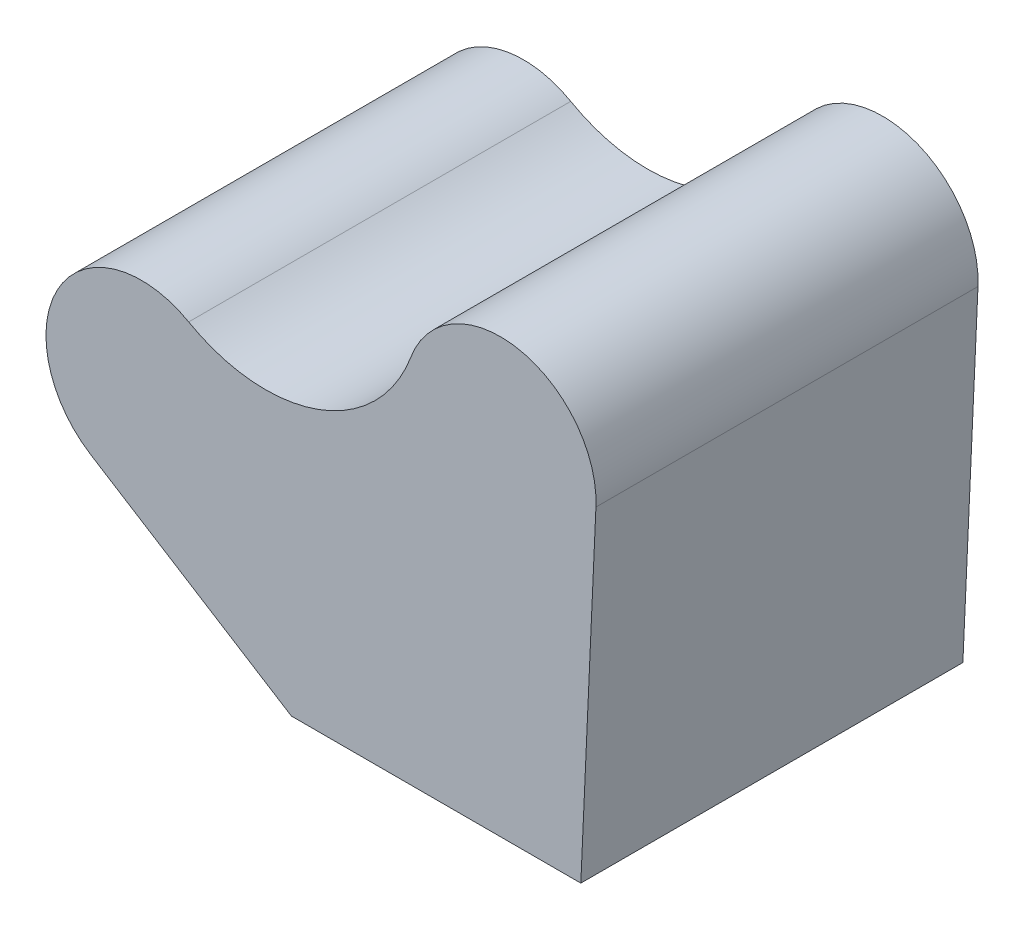
ISO-10303-21;
HEADER;
FILE_DESCRIPTION(('STEP AP214'),'2;1');
FILE_NAME('part.step','',(''),(''),'','','');
FILE_SCHEMA(('AUTOMOTIVE_DESIGN { 1 0 10303 214 1 1 1 1 }'));
ENDSEC;
DATA;
#1=APPLICATION_CONTEXT('core data for automotive mechanical design processes');
#2=APPLICATION_PROTOCOL_DEFINITION('international standard','automotive_design',2000,#1);
#3=PRODUCT_CONTEXT('',#1,'mechanical');
#4=PRODUCT('Part','Part','',(#3));
#5=PRODUCT_RELATED_PRODUCT_CATEGORY('part','',(#4));
#6=PRODUCT_DEFINITION_FORMATION('','',#4);
#7=PRODUCT_DEFINITION_CONTEXT('part definition',#1,'design');
#8=PRODUCT_DEFINITION('design','',#6,#7);
#9=PRODUCT_DEFINITION_SHAPE('','',#8);
#10=(LENGTH_UNIT() NAMED_UNIT(*) SI_UNIT(.MILLI.,.METRE.));
#11=(NAMED_UNIT(*) PLANE_ANGLE_UNIT() SI_UNIT($,.RADIAN.));
#12=(NAMED_UNIT(*) SI_UNIT($,.STERADIAN.) SOLID_ANGLE_UNIT());
#13=UNCERTAINTY_MEASURE_WITH_UNIT(LENGTH_MEASURE(1.E-05),#10,'distance_accuracy_value','');
#14=(GEOMETRIC_REPRESENTATION_CONTEXT(3) GLOBAL_UNCERTAINTY_ASSIGNED_CONTEXT((#13)) GLOBAL_UNIT_ASSIGNED_CONTEXT((#10,
#11,#12)) REPRESENTATION_CONTEXT('',''));
#15=CARTESIAN_POINT('',(0.,0.,0.));
#16=DIRECTION('',(0.,0.,1.));
#17=DIRECTION('',(1.,0.,0.));
#18=AXIS2_PLACEMENT_3D('',#15,#16,#17);
#19=CARTESIAN_POINT('',(0.,0.,20.));
#20=DIRECTION('',(0.,0.,-1.));
#21=DIRECTION('',(-1.,0.,0.));
#22=AXIS2_PLACEMENT_3D('',#19,#20,#21);
#23=CYLINDRICAL_SURFACE('',#22,10.);
#24=CARTESIAN_POINT('',(0.,0.,-20.));
#25=DIRECTION('',(0.,0.,-1.));
#26=DIRECTION('',(-1.,0.,0.));
#27=AXIS2_PLACEMENT_3D('',#24,#25,#26);
#28=CIRCLE('',#27,10.);
#29=CARTESIAN_POINT('',(-5.31863120767935,-8.46830337651523,-20.));
#30=VERTEX_POINT('',#29);
#31=CARTESIAN_POINT('',(4.94046004116646,8.69435762903951,-20.));
#32=VERTEX_POINT('',#31);
#33=EDGE_CURVE('E122',#30,#32,#28,.T.);
#34=ORIENTED_EDGE('',*,*,#33,.F.);
#35=DIRECTION('',(0.,0.,-1.));
#36=VECTOR('',#35,1.);
#37=CARTESIAN_POINT('',(-5.31863120767935,-8.46830337651523,20.));
#38=LINE('',#37,#36);
#39=CARTESIAN_POINT('',(-5.31863120767935,-8.46830337651523,20.));
#40=VERTEX_POINT('',#39);
#41=EDGE_CURVE('E11',#40,#30,#38,.T.);
#42=ORIENTED_EDGE('',*,*,#41,.F.);
#43=CARTESIAN_POINT('',(0.,0.,20.));
#44=DIRECTION('',(0.,0.,-1.));
#45=DIRECTION('',(-1.,0.,0.));
#46=AXIS2_PLACEMENT_3D('',#43,#44,#45);
#47=CIRCLE('',#46,10.);
#48=CARTESIAN_POINT('',(4.94046004116646,8.69435762903951,20.));
#49=VERTEX_POINT('',#48);
#50=EDGE_CURVE('E134',#40,#49,#47,.T.);
#51=ORIENTED_EDGE('',*,*,#50,.T.);
#52=DIRECTION('',(0.,0.,-1.));
#53=VECTOR('',#52,1.);
#54=CARTESIAN_POINT('',(4.94046004116646,8.69435762903951,20.));
#55=LINE('',#54,#53);
#56=EDGE_CURVE('E38',#49,#32,#55,.T.);
#57=ORIENTED_EDGE('',*,*,#56,.T.);
#58=EDGE_LOOP('',(#34,#42,#51,#57));
#59=FACE_BOUND('',#58,.T.);
#60=ADVANCED_FACE('F35',(#59),#23,.T.);
#61=CARTESIAN_POINT('',(-5.31863120767935,-8.46830337651523,20.));
#62=DIRECTION('',(0.531863120767936,0.846830337651523,0.));
#63=DIRECTION('',(-0.846830337651523,0.531863120767936,0.));
#64=AXIS2_PLACEMENT_3D('',#61,#62,#63);
#65=PLANE('',#64);
#66=DIRECTION('',(0.846830337651523,-0.531863120767936,0.));
#67=VECTOR('',#66,1.);
#68=CARTESIAN_POINT('',(-5.31863120767935,-8.46830337651523,-20.));
#69=LINE('',#68,#67);
#70=CARTESIAN_POINT('',(15.689460365573,-21.6627162934111,-20.));
#71=VERTEX_POINT('',#70);
#72=EDGE_CURVE('E74',#30,#71,#69,.T.);
#73=ORIENTED_EDGE('',*,*,#72,.T.);
#74=DIRECTION('',(0.,0.,-1.));
#75=VECTOR('',#74,1.);
#76=CARTESIAN_POINT('',(15.689460365573,-21.6627162934111,20.));
#77=LINE('',#76,#75);
#78=CARTESIAN_POINT('',(15.689460365573,-21.6627162934111,20.));
#79=VERTEX_POINT('',#78);
#80=EDGE_CURVE('E44',#79,#71,#77,.T.);
#81=ORIENTED_EDGE('',*,*,#80,.F.);
#82=DIRECTION('',(0.846830337651523,-0.531863120767936,0.));
#83=VECTOR('',#82,1.);
#84=CARTESIAN_POINT('',(-5.31863120767935,-8.46830337651523,20.));
#85=LINE('',#84,#83);
#86=EDGE_CURVE('E101',#40,#79,#85,.T.);
#87=ORIENTED_EDGE('',*,*,#86,.F.);
#88=ORIENTED_EDGE('',*,*,#41,.T.);
#89=EDGE_LOOP('',(#73,#81,#87,#88));
#90=FACE_BOUND('',#89,.T.);
#91=ADVANCED_FACE('F153',(#90),#65,.F.);
#92=CARTESIAN_POINT('',(15.689460365573,-21.6627162934111,20.));
#93=DIRECTION('',(0.,1.,0.));
#94=DIRECTION('',(-1.,0.,0.));
#95=AXIS2_PLACEMENT_3D('',#92,#93,#94);
#96=PLANE('',#95);
#97=DIRECTION('',(1.,0.,0.));
#98=VECTOR('',#97,1.);
#99=CARTESIAN_POINT('',(15.689460365573,-21.6627162934111,-20.));
#100=LINE('',#99,#98);
#101=CARTESIAN_POINT('',(45.9952917199994,-21.6627162934111,-20.));
#102=VERTEX_POINT('',#101);
#103=EDGE_CURVE('E108',#71,#102,#100,.T.);
#104=ORIENTED_EDGE('',*,*,#103,.T.);
#105=DIRECTION('',(0.,0.,-1.));
#106=VECTOR('',#105,1.);
#107=CARTESIAN_POINT('',(45.9952917199994,-21.6627162934111,20.));
#108=LINE('',#107,#106);
#109=CARTESIAN_POINT('',(45.9952917199994,-21.6627162934111,20.));
#110=VERTEX_POINT('',#109);
#111=EDGE_CURVE('E105',#110,#102,#108,.T.);
#112=ORIENTED_EDGE('',*,*,#111,.F.);
#113=DIRECTION('',(1.,0.,0.));
#114=VECTOR('',#113,1.);
#115=CARTESIAN_POINT('',(15.689460365573,-21.6627162934111,20.));
#116=LINE('',#115,#114);
#117=EDGE_CURVE('E93',#79,#110,#116,.T.);
#118=ORIENTED_EDGE('',*,*,#117,.F.);
#119=ORIENTED_EDGE('',*,*,#80,.T.);
#120=EDGE_LOOP('',(#104,#112,#118,#119));
#121=FACE_BOUND('',#120,.T.);
#122=ADVANCED_FACE('F106',(#121),#96,.F.);
#123=CARTESIAN_POINT('',(47.5774393384329,13.2278107223206,20.));
#124=DIRECTION('',(0.998973450699644,-0.0452995010705945,0.));
#125=DIRECTION('',(0.0452995010705945,0.998973450699645,0.));
#126=AXIS2_PLACEMENT_3D('',#123,#124,#125);
#127=PLANE('',#126);
#128=DIRECTION('',(-0.0452995010705945,-0.998973450699644,0.));
#129=VECTOR('',#128,1.);
#130=CARTESIAN_POINT('',(47.5774393384329,13.2278107223206,-20.));
#131=LINE('',#130,#129);
#132=CARTESIAN_POINT('',(47.5774393384329,13.2278107223206,-20.));
#133=VERTEX_POINT('',#132);
#134=EDGE_CURVE('E131',#133,#102,#131,.T.);
#135=ORIENTED_EDGE('',*,*,#134,.F.);
#136=DIRECTION('',(0.,0.,-1.));
#137=VECTOR('',#136,1.);
#138=CARTESIAN_POINT('',(47.5774393384329,13.2278107223206,20.));
#139=LINE('',#138,#137);
#140=CARTESIAN_POINT('',(47.5774393384329,13.2278107223206,20.));
#141=VERTEX_POINT('',#140);
#142=EDGE_CURVE('E112',#141,#133,#139,.T.);
#143=ORIENTED_EDGE('',*,*,#142,.F.);
#144=DIRECTION('',(-0.0452995010705945,-0.998973450699644,0.));
#145=VECTOR('',#144,1.);
#146=CARTESIAN_POINT('',(47.5774393384329,13.2278107223206,20.));
#147=LINE('',#146,#145);
#148=EDGE_CURVE('E99',#141,#110,#147,.T.);
#149=ORIENTED_EDGE('',*,*,#148,.T.);
#150=ORIENTED_EDGE('',*,*,#111,.T.);
#151=EDGE_LOOP('',(#135,#143,#149,#150));
#152=FACE_BOUND('',#151,.T.);
#153=ADVANCED_FACE('F114',(#152),#127,.T.);
#154=CARTESIAN_POINT('',(37.5877048314364,13.6808057330265,20.));
#155=DIRECTION('',(0.,0.,-1.));
#156=DIRECTION('',(-1.,0.,0.));
#157=AXIS2_PLACEMENT_3D('',#154,#155,#156);
#158=CYLINDRICAL_SURFACE('',#157,10.);
#159=CARTESIAN_POINT('',(37.5877048314364,13.6808057330265,-20.));
#160=DIRECTION('',(0.,0.,-1.));
#161=DIRECTION('',(-1.,0.,0.));
#162=AXIS2_PLACEMENT_3D('',#159,#160,#161);
#163=CIRCLE('',#162,10.);
#164=CARTESIAN_POINT('',(28.2144675123193,17.1654035806282,-20.));
#165=VERTEX_POINT('',#164);
#166=EDGE_CURVE('E128',#165,#133,#163,.T.);
#167=ORIENTED_EDGE('',*,*,#166,.F.);
#168=DIRECTION('',(0.,0.,-1.));
#169=VECTOR('',#168,1.);
#170=CARTESIAN_POINT('',(28.2144675123193,17.1654035806282,20.));
#171=LINE('',#170,#169);
#172=CARTESIAN_POINT('',(28.2144675123193,17.1654035806282,20.));
#173=VERTEX_POINT('',#172);
#174=EDGE_CURVE('E137',#173,#165,#171,.T.);
#175=ORIENTED_EDGE('',*,*,#174,.F.);
#176=CARTESIAN_POINT('',(37.5877048314364,13.6808057330265,20.));
#177=DIRECTION('',(0.,0.,-1.));
#178=DIRECTION('',(-1.,0.,0.));
#179=AXIS2_PLACEMENT_3D('',#176,#177,#178);
#180=CIRCLE('',#179,10.);
#181=EDGE_CURVE('E115',#173,#141,#180,.T.);
#182=ORIENTED_EDGE('',*,*,#181,.T.);
#183=ORIENTED_EDGE('',*,*,#142,.T.);
#184=EDGE_LOOP('',(#167,#175,#182,#183));
#185=FACE_BOUND('',#184,.T.);
#186=ADVANCED_FACE('F143',(#185),#158,.T.);
#187=CARTESIAN_POINT('',(12.9736258273936,22.8313439940448,20.));
#188=DIRECTION('',(0.,0.,-1.));
#189=DIRECTION('',(-1.,0.,0.));
#190=AXIS2_PLACEMENT_3D('',#187,#188,#189);
#191=CYLINDRICAL_SURFACE('',#190,16.2599549825132);
#192=CARTESIAN_POINT('',(12.9736258273936,22.8313439940448,-20.));
#193=DIRECTION('',(0.,0.,1.));
#194=DIRECTION('',(1.,0.,0.));
#195=AXIS2_PLACEMENT_3D('',#192,#193,#194);
#196=CIRCLE('',#195,16.2599549825132);
#197=EDGE_CURVE('E125',#32,#165,#196,.T.);
#198=ORIENTED_EDGE('',*,*,#197,.F.);
#199=ORIENTED_EDGE('',*,*,#56,.F.);
#200=CARTESIAN_POINT('',(12.9736258273936,22.8313439940448,20.));
#201=DIRECTION('',(0.,0.,1.));
#202=DIRECTION('',(1.,0.,0.));
#203=AXIS2_PLACEMENT_3D('',#200,#201,#202);
#204=CIRCLE('',#203,16.2599549825132);
#205=EDGE_CURVE('E117',#49,#173,#204,.T.);
#206=ORIENTED_EDGE('',*,*,#205,.T.);
#207=ORIENTED_EDGE('',*,*,#174,.T.);
#208=EDGE_LOOP('',(#198,#199,#206,#207));
#209=FACE_BOUND('',#208,.T.);
#210=ADVANCED_FACE('F139',(#209),#191,.F.);
#211=CARTESIAN_POINT('',(0.,0.,20.));
#212=DIRECTION('',(0.,0.,-1.));
#213=DIRECTION('',(-1.,0.,0.));
#214=AXIS2_PLACEMENT_3D('',#211,#212,#213);
#215=PLANE('',#214);
#216=ORIENTED_EDGE('',*,*,#50,.F.);
#217=ORIENTED_EDGE('',*,*,#86,.T.);
#218=ORIENTED_EDGE('',*,*,#117,.T.);
#219=ORIENTED_EDGE('',*,*,#148,.F.);
#220=ORIENTED_EDGE('',*,*,#181,.F.);
#221=ORIENTED_EDGE('',*,*,#205,.F.);
#222=EDGE_LOOP('',(#216,#217,#218,#219,#220,#221));
#223=FACE_BOUND('',#222,.T.);
#224=ADVANCED_FACE('F96',(#223),#215,.F.);
#225=CARTESIAN_POINT('',(0.,0.,-20.));
#226=DIRECTION('',(0.,0.,-1.));
#227=DIRECTION('',(-1.,0.,0.));
#228=AXIS2_PLACEMENT_3D('',#225,#226,#227);
#229=PLANE('',#228);
#230=ORIENTED_EDGE('',*,*,#33,.T.);
#231=ORIENTED_EDGE('',*,*,#197,.T.);
#232=ORIENTED_EDGE('',*,*,#166,.T.);
#233=ORIENTED_EDGE('',*,*,#134,.T.);
#234=ORIENTED_EDGE('',*,*,#103,.F.);
#235=ORIENTED_EDGE('',*,*,#72,.F.);
#236=EDGE_LOOP('',(#230,#231,#232,#233,#234,#235));
#237=FACE_BOUND('',#236,.T.);
#238=ADVANCED_FACE('F141',(#237),#229,.T.);
#239=CLOSED_SHELL('',(#60,#91,#122,#153,#186,#210,#224,#238));
#240=MANIFOLD_SOLID_BREP('B2',#239);
#241=ADVANCED_BREP_SHAPE_REPRESENTATION('',(#18,#240),#14);
#242=SHAPE_DEFINITION_REPRESENTATION(#9,#241);
ENDSEC;
END-ISO-10303-21;
